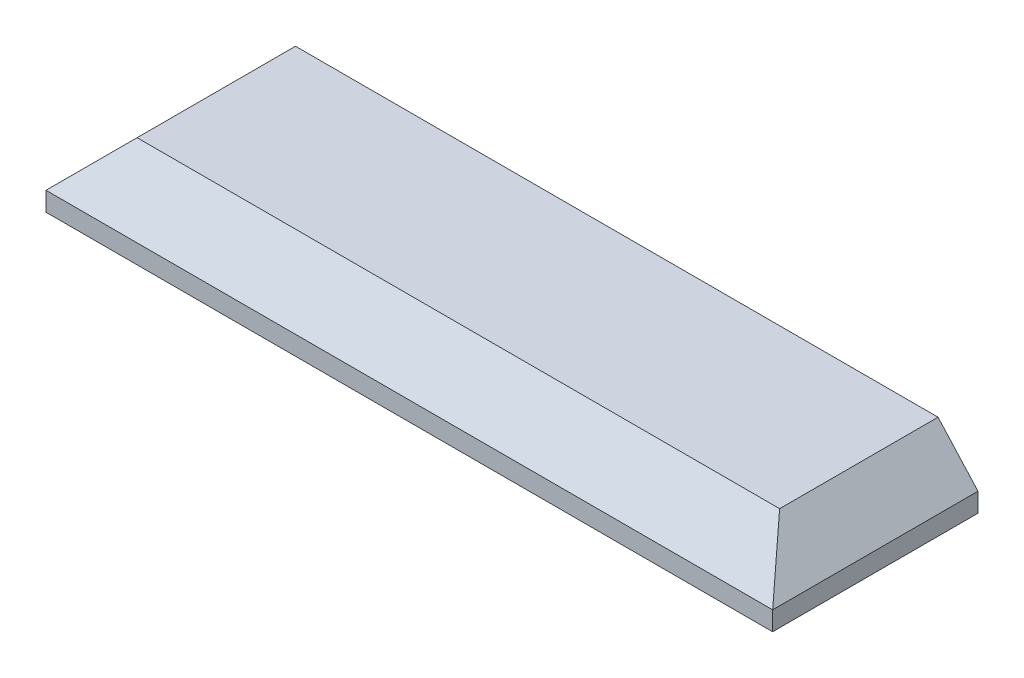
ISO-10303-21;
HEADER;
FILE_DESCRIPTION(('STEP AP214'),'2;1');
FILE_NAME('part.step','',(''),(''),'','','');
FILE_SCHEMA(('AUTOMOTIVE_DESIGN { 1 0 10303 214 1 1 1 1 }'));
ENDSEC;
DATA;
#1=APPLICATION_CONTEXT('core data for automotive mechanical design processes');
#2=APPLICATION_PROTOCOL_DEFINITION('international standard','automotive_design',2000,#1);
#3=PRODUCT_CONTEXT('',#1,'mechanical');
#4=PRODUCT('Part','Part','',(#3));
#5=PRODUCT_RELATED_PRODUCT_CATEGORY('part','',(#4));
#6=PRODUCT_DEFINITION_FORMATION('','',#4);
#7=PRODUCT_DEFINITION_CONTEXT('part definition',#1,'design');
#8=PRODUCT_DEFINITION('design','',#6,#7);
#9=PRODUCT_DEFINITION_SHAPE('','',#8);
#10=(LENGTH_UNIT() NAMED_UNIT(*) SI_UNIT(.MILLI.,.METRE.));
#11=(NAMED_UNIT(*) PLANE_ANGLE_UNIT() SI_UNIT($,.RADIAN.));
#12=(NAMED_UNIT(*) SI_UNIT($,.STERADIAN.) SOLID_ANGLE_UNIT());
#13=UNCERTAINTY_MEASURE_WITH_UNIT(LENGTH_MEASURE(1.E-05),#10,'distance_accuracy_value','');
#14=(GEOMETRIC_REPRESENTATION_CONTEXT(3) GLOBAL_UNCERTAINTY_ASSIGNED_CONTEXT((#13)) GLOBAL_UNIT_ASSIGNED_CONTEXT((#10,
#11,#12)) REPRESENTATION_CONTEXT('',''));
#15=CARTESIAN_POINT('',(0.,0.,0.));
#16=DIRECTION('',(0.,0.,1.));
#17=DIRECTION('',(1.,0.,0.));
#18=AXIS2_PLACEMENT_3D('',#15,#16,#17);
#19=CARTESIAN_POINT('',(0.,0.,13.));
#20=DIRECTION('',(1.,0.,0.));
#21=DIRECTION('',(0.,0.,-1.));
#22=AXIS2_PLACEMENT_3D('',#19,#20,#21);
#23=PLANE('',#22);
#24=DIRECTION('',(0.,-1.,0.));
#25=VECTOR('',#24,1.);
#26=CARTESIAN_POINT('',(0.,0.,13.));
#27=LINE('',#26,#25);
#28=CARTESIAN_POINT('',(0.,1.20448606758841,13.));
#29=VERTEX_POINT('',#28);
#30=CARTESIAN_POINT('',(0.,0.,13.));
#31=VERTEX_POINT('',#30);
#32=EDGE_CURVE('E98',#29,#31,#27,.T.);
#33=ORIENTED_EDGE('',*,*,#32,.F.);
#34=DIRECTION('',(0.,0.,1.));
#35=VECTOR('',#34,1.);
#36=CARTESIAN_POINT('',(0.,1.20448606758841,-33.));
#37=LINE('',#36,#35);
#38=CARTESIAN_POINT('',(0.,1.20448606758841,0.));
#39=VERTEX_POINT('',#38);
#40=EDGE_CURVE('E55',#39,#29,#37,.T.);
#41=ORIENTED_EDGE('',*,*,#40,.F.);
#42=DIRECTION('',(0.,-1.,0.));
#43=VECTOR('',#42,1.);
#44=CARTESIAN_POINT('',(0.,0.,0.));
#45=LINE('',#44,#43);
#46=CARTESIAN_POINT('',(0.,0.,0.));
#47=VERTEX_POINT('',#46);
#48=EDGE_CURVE('E96',#39,#47,#45,.T.);
#49=ORIENTED_EDGE('',*,*,#48,.T.);
#50=DIRECTION('',(0.,0.,-1.));
#51=VECTOR('',#50,1.);
#52=CARTESIAN_POINT('',(0.,0.,13.));
#53=LINE('',#52,#51);
#54=EDGE_CURVE('E120',#31,#47,#53,.T.);
#55=ORIENTED_EDGE('',*,*,#54,.F.);
#56=EDGE_LOOP('',(#33,#41,#49,#55));
#57=FACE_BOUND('',#56,.T.);
#58=ADVANCED_FACE('F33',(#57),#23,.F.);
#59=CARTESIAN_POINT('',(0.,0.,13.));
#60=DIRECTION('',(0.,1.,0.));
#61=DIRECTION('',(0.,0.,1.));
#62=AXIS2_PLACEMENT_3D('',#59,#60,#61);
#63=PLANE('',#62);
#64=DIRECTION('',(1.,0.,0.));
#65=VECTOR('',#64,1.);
#66=CARTESIAN_POINT('',(0.,0.,0.));
#67=LINE('',#66,#65);
#68=CARTESIAN_POINT('',(46.,0.,0.));
#69=VERTEX_POINT('',#68);
#70=EDGE_CURVE('E102',#47,#69,#67,.T.);
#71=ORIENTED_EDGE('',*,*,#70,.T.);
#72=DIRECTION('',(0.,0.,-1.));
#73=VECTOR('',#72,1.);
#74=CARTESIAN_POINT('',(46.,0.,13.));
#75=LINE('',#74,#73);
#76=CARTESIAN_POINT('',(46.,0.,13.));
#77=VERTEX_POINT('',#76);
#78=EDGE_CURVE('E117',#77,#69,#75,.T.);
#79=ORIENTED_EDGE('',*,*,#78,.F.);
#80=DIRECTION('',(1.,0.,0.));
#81=VECTOR('',#80,1.);
#82=CARTESIAN_POINT('',(0.,0.,13.));
#83=LINE('',#82,#81);
#84=EDGE_CURVE('E142',#31,#77,#83,.T.);
#85=ORIENTED_EDGE('',*,*,#84,.F.);
#86=ORIENTED_EDGE('',*,*,#54,.T.);
#87=EDGE_LOOP('',(#71,#79,#85,#86));
#88=FACE_BOUND('',#87,.T.);
#89=ADVANCED_FACE('F148',(#88),#63,.F.);
#90=CARTESIAN_POINT('',(46.,0.,13.));
#91=DIRECTION('',(-1.,0.,0.));
#92=DIRECTION('',(0.,0.,1.));
#93=AXIS2_PLACEMENT_3D('',#90,#91,#92);
#94=PLANE('',#93);
#95=DIRECTION('',(0.,1.,0.));
#96=VECTOR('',#95,1.);
#97=CARTESIAN_POINT('',(46.,0.,0.));
#98=LINE('',#97,#96);
#99=CARTESIAN_POINT('',(46.,1.20448606758841,0.));
#100=VERTEX_POINT('',#99);
#101=EDGE_CURVE('E105',#69,#100,#98,.T.);
#102=ORIENTED_EDGE('',*,*,#101,.T.);
#103=DIRECTION('',(0.,0.,1.));
#104=VECTOR('',#103,1.);
#105=CARTESIAN_POINT('',(46.,1.20448606758841,-33.));
#106=LINE('',#105,#104);
#107=CARTESIAN_POINT('',(46.,1.20448606758841,13.));
#108=VERTEX_POINT('',#107);
#109=EDGE_CURVE('E130',#100,#108,#106,.T.);
#110=ORIENTED_EDGE('',*,*,#109,.T.);
#111=DIRECTION('',(0.,1.,0.));
#112=VECTOR('',#111,1.);
#113=CARTESIAN_POINT('',(46.,0.,13.));
#114=LINE('',#113,#112);
#115=EDGE_CURVE('E110',#77,#108,#114,.T.);
#116=ORIENTED_EDGE('',*,*,#115,.F.);
#117=ORIENTED_EDGE('',*,*,#78,.T.);
#118=EDGE_LOOP('',(#102,#110,#116,#117));
#119=FACE_BOUND('',#118,.T.);
#120=ADVANCED_FACE('F134',(#119),#94,.F.);
#121=CARTESIAN_POINT('',(0.,4.,13.));
#122=DIRECTION('',(0.,-1.,0.));
#123=DIRECTION('',(0.,0.,-1.));
#124=AXIS2_PLACEMENT_3D('',#121,#122,#123);
#125=PLANE('',#124);
#126=DIRECTION('',(-1.,0.,0.));
#127=VECTOR('',#126,1.);
#128=CARTESIAN_POINT('',(0.,4.,0.));
#129=LINE('',#128,#127);
#130=CARTESIAN_POINT('',(43.4715713559597,4.,0.));
#131=VERTEX_POINT('',#130);
#132=CARTESIAN_POINT('',(2.79551393241158,4.,0.));
#133=VERTEX_POINT('',#132);
#134=EDGE_CURVE('E115',#131,#133,#129,.T.);
#135=ORIENTED_EDGE('',*,*,#134,.T.);
#136=DIRECTION('',(0.,0.,1.));
#137=VECTOR('',#136,1.);
#138=CARTESIAN_POINT('',(2.79551393241158,4.,13.));
#139=LINE('',#138,#137);
#140=CARTESIAN_POINT('',(2.79551393241158,4.,10.0296752631379));
#141=VERTEX_POINT('',#140);
#142=EDGE_CURVE('E86',#133,#141,#139,.T.);
#143=ORIENTED_EDGE('',*,*,#142,.T.);
#144=DIRECTION('',(1.,0.,0.));
#145=VECTOR('',#144,1.);
#146=CARTESIAN_POINT('',(0.,4.,10.0296752631379));
#147=LINE('',#146,#145);
#148=CARTESIAN_POINT('',(43.4715713559597,4.,10.0296752631379));
#149=VERTEX_POINT('',#148);
#150=EDGE_CURVE('E47',#141,#149,#147,.T.);
#151=ORIENTED_EDGE('',*,*,#150,.T.);
#152=DIRECTION('',(0.,0.,1.));
#153=VECTOR('',#152,1.);
#154=CARTESIAN_POINT('',(43.4715713559597,4.,-33.));
#155=LINE('',#154,#153);
#156=EDGE_CURVE('E91',#131,#149,#155,.T.);
#157=ORIENTED_EDGE('',*,*,#156,.F.);
#158=EDGE_LOOP('',(#135,#143,#151,#157));
#159=FACE_BOUND('',#158,.T.);
#160=ADVANCED_FACE('F149',(#159),#125,.F.);
#161=CARTESIAN_POINT('',(0.,0.,13.));
#162=DIRECTION('',(0.,0.,-1.));
#163=DIRECTION('',(-1.,0.,0.));
#164=AXIS2_PLACEMENT_3D('',#161,#162,#163);
#165=PLANE('',#164);
#166=ORIENTED_EDGE('',*,*,#115,.T.);
#167=DIRECTION('',(1.,0.,0.));
#168=VECTOR('',#167,1.);
#169=CARTESIAN_POINT('',(0.,1.20448606758841,13.));
#170=LINE('',#169,#168);
#171=EDGE_CURVE('E107',#29,#108,#170,.T.);
#172=ORIENTED_EDGE('',*,*,#171,.F.);
#173=ORIENTED_EDGE('',*,*,#32,.T.);
#174=ORIENTED_EDGE('',*,*,#84,.T.);
#175=EDGE_LOOP('',(#166,#172,#173,#174));
#176=FACE_BOUND('',#175,.T.);
#177=ADVANCED_FACE('F146',(#176),#165,.F.);
#178=CARTESIAN_POINT('',(0.,0.,0.));
#179=DIRECTION('',(0.,0.,-1.));
#180=DIRECTION('',(-1.,0.,0.));
#181=AXIS2_PLACEMENT_3D('',#178,#179,#180);
#182=PLANE('',#181);
#183=DIRECTION('',(-0.707106781186546,-0.707106781186549,0.));
#184=VECTOR('',#183,1.);
#185=CARTESIAN_POINT('',(-0.602243033794204,0.602243033794202,0.));
#186=LINE('',#185,#184);
#187=EDGE_CURVE('E84',#133,#39,#186,.T.);
#188=ORIENTED_EDGE('',*,*,#187,.F.);
#189=ORIENTED_EDGE('',*,*,#134,.F.);
#190=DIRECTION('',(-0.670789918493963,0.741647413025126,0.));
#191=VECTOR('',#190,1.);
#192=CARTESIAN_POINT('',(25.9011000226417,23.4264914404862,0.));
#193=LINE('',#192,#191);
#194=EDGE_CURVE('E135',#100,#131,#193,.T.);
#195=ORIENTED_EDGE('',*,*,#194,.F.);
#196=ORIENTED_EDGE('',*,*,#101,.F.);
#197=ORIENTED_EDGE('',*,*,#70,.F.);
#198=ORIENTED_EDGE('',*,*,#48,.F.);
#199=EDGE_LOOP('',(#188,#189,#195,#196,#197,#198));
#200=FACE_BOUND('',#199,.T.);
#201=ADVANCED_FACE('F100',(#200),#182,.T.);
#202=CARTESIAN_POINT('',(0.,4.,10.0296752631379));
#203=DIRECTION('',(0.,-0.728210493193777,-0.685353542051455));
#204=DIRECTION('',(0.,0.685353542051455,-0.728210493193777));
#205=AXIS2_PLACEMENT_3D('',#202,#203,#204);
#206=PLANE('',#205);
#207=ORIENTED_EDGE('',*,*,#150,.F.);
#208=DIRECTION('',(-0.565325940930604,-0.565325940930606,0.600677251959697));
#209=VECTOR('',#208,1.);
#210=CARTESIAN_POINT('',(1.90208607552281,3.10657214311123,10.9789715027846));
#211=LINE('',#210,#209);
#212=EDGE_CURVE('E11',#141,#29,#211,.T.);
#213=ORIENTED_EDGE('',*,*,#212,.T.);
#214=ORIENTED_EDGE('',*,*,#171,.T.);
#215=DIRECTION('',(-0.526862555945485,0.582516583603502,-0.618942870521581));
#216=VECTOR('',#215,1.);
#217=CARTESIAN_POINT('',(31.4045520477352,17.3416937346972,-4.1463095074417));
#218=LINE('',#217,#216);
#219=EDGE_CURVE('E40',#108,#149,#218,.T.);
#220=ORIENTED_EDGE('',*,*,#219,.T.);
#221=EDGE_LOOP('',(#207,#213,#214,#220));
#222=FACE_BOUND('',#221,.T.);
#223=ADVANCED_FACE('F124',(#222),#206,.F.);
#224=CARTESIAN_POINT('',(46.,1.20448606758841,-33.));
#225=DIRECTION('',(-0.741647413025126,-0.670789918493963,0.));
#226=DIRECTION('',(0.670789918493963,-0.741647413025126,0.));
#227=AXIS2_PLACEMENT_3D('',#224,#225,#226);
#228=PLANE('',#227);
#229=ORIENTED_EDGE('',*,*,#194,.T.);
#230=ORIENTED_EDGE('',*,*,#156,.T.);
#231=ORIENTED_EDGE('',*,*,#219,.F.);
#232=ORIENTED_EDGE('',*,*,#109,.F.);
#233=EDGE_LOOP('',(#229,#230,#231,#232));
#234=FACE_BOUND('',#233,.T.);
#235=ADVANCED_FACE('F129',(#234),#228,.F.);
#236=CARTESIAN_POINT('',(0.,1.20448606758841,-33.));
#237=DIRECTION('',(0.707106781186549,-0.707106781186546,0.));
#238=DIRECTION('',(0.707106781186546,0.707106781186549,0.));
#239=AXIS2_PLACEMENT_3D('',#236,#237,#238);
#240=PLANE('',#239);
#241=ORIENTED_EDGE('',*,*,#187,.T.);
#242=ORIENTED_EDGE('',*,*,#40,.T.);
#243=ORIENTED_EDGE('',*,*,#212,.F.);
#244=ORIENTED_EDGE('',*,*,#142,.F.);
#245=EDGE_LOOP('',(#241,#242,#243,#244));
#246=FACE_BOUND('',#245,.T.);
#247=ADVANCED_FACE('F85',(#246),#240,.F.);
#248=CLOSED_SHELL('',(#58,#89,#120,#160,#177,#201,#223,#235,#247));
#249=MANIFOLD_SOLID_BREP('B2',#248);
#250=ADVANCED_BREP_SHAPE_REPRESENTATION('',(#18,#249),#14);
#251=SHAPE_DEFINITION_REPRESENTATION(#9,#250);
ENDSEC;
END-ISO-10303-21;
